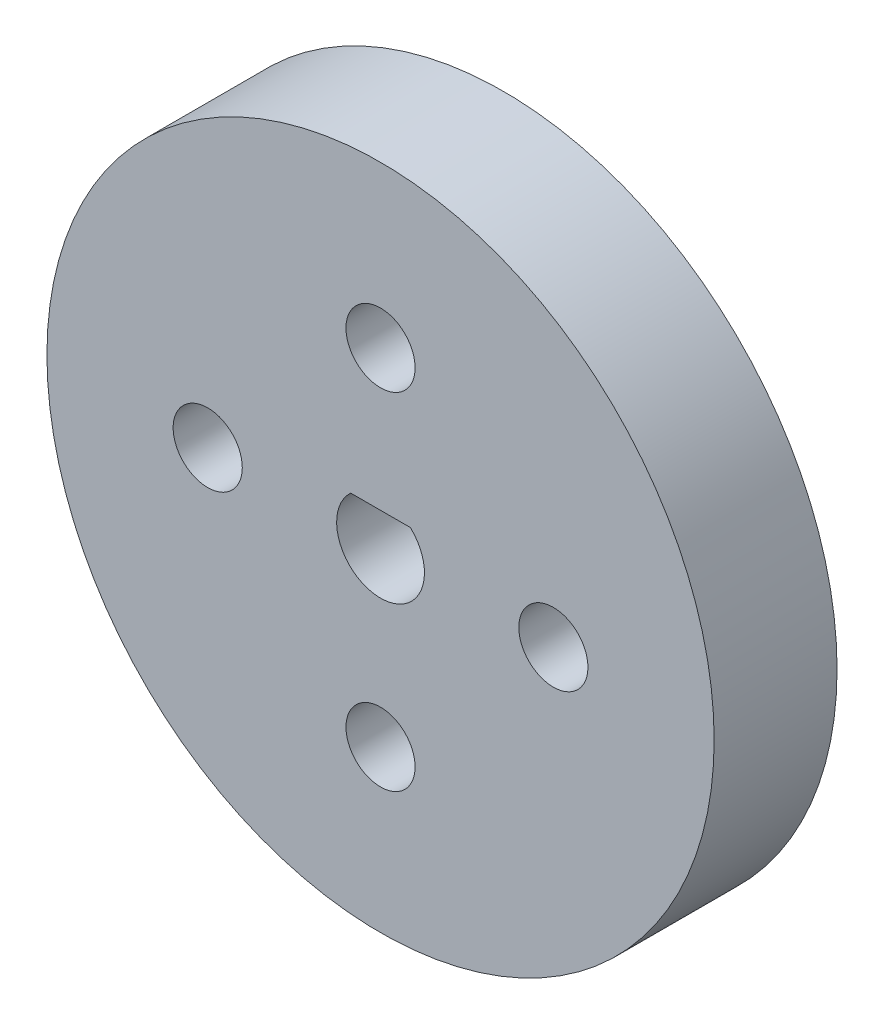
ISO-10303-21;
HEADER;
FILE_DESCRIPTION(('STEP AP214'),'2;1');
FILE_NAME('part.step','',(''),(''),'','','');
FILE_SCHEMA(('AUTOMOTIVE_DESIGN { 1 0 10303 214 1 1 1 1 }'));
ENDSEC;
DATA;
#1=APPLICATION_CONTEXT('core data for automotive mechanical design processes');
#2=APPLICATION_PROTOCOL_DEFINITION('international standard','automotive_design',2000,#1);
#3=PRODUCT_CONTEXT('',#1,'mechanical');
#4=PRODUCT('Part','Part','',(#3));
#5=PRODUCT_RELATED_PRODUCT_CATEGORY('part','',(#4));
#6=PRODUCT_DEFINITION_FORMATION('','',#4);
#7=PRODUCT_DEFINITION_CONTEXT('part definition',#1,'design');
#8=PRODUCT_DEFINITION('design','',#6,#7);
#9=PRODUCT_DEFINITION_SHAPE('','',#8);
#10=(LENGTH_UNIT() NAMED_UNIT(*) SI_UNIT(.MILLI.,.METRE.));
#11=(NAMED_UNIT(*) PLANE_ANGLE_UNIT() SI_UNIT($,.RADIAN.));
#12=(NAMED_UNIT(*) SI_UNIT($,.STERADIAN.) SOLID_ANGLE_UNIT());
#13=UNCERTAINTY_MEASURE_WITH_UNIT(LENGTH_MEASURE(1.E-05),#10,'distance_accuracy_value','');
#14=(GEOMETRIC_REPRESENTATION_CONTEXT(3) GLOBAL_UNCERTAINTY_ASSIGNED_CONTEXT((#13)) GLOBAL_UNIT_ASSIGNED_CONTEXT((#10,
#11,#12)) REPRESENTATION_CONTEXT('',''));
#15=CARTESIAN_POINT('',(0.,0.,0.));
#16=DIRECTION('',(0.,0.,1.));
#17=DIRECTION('',(1.,0.,0.));
#18=AXIS2_PLACEMENT_3D('',#15,#16,#17);
#19=CARTESIAN_POINT('',(0.,0.,5.334));
#20=DIRECTION('',(0.,0.,-1.));
#21=DIRECTION('',(-1.,0.,0.));
#22=AXIS2_PLACEMENT_3D('',#19,#20,#21);
#23=CYLINDRICAL_SURFACE('',#22,14.478);
#24=CARTESIAN_POINT('',(0.,0.,5.334));
#25=DIRECTION('',(0.,0.,1.));
#26=DIRECTION('',(1.,0.,0.));
#27=AXIS2_PLACEMENT_3D('',#24,#25,#26);
#28=CIRCLE('',#27,14.478);
#29=CARTESIAN_POINT('',(14.478,0.,5.334));
#30=VERTEX_POINT('',#29);
#31=EDGE_CURVE('E11',#30,#30,#28,.T.);
#32=ORIENTED_EDGE('',*,*,#31,.F.);
#33=EDGE_LOOP('',(#32));
#34=FACE_BOUND('',#33,.T.);
#35=CARTESIAN_POINT('',(0.,0.,0.));
#36=DIRECTION('',(0.,0.,1.));
#37=DIRECTION('',(1.,0.,0.));
#38=AXIS2_PLACEMENT_3D('',#35,#36,#37);
#39=CIRCLE('',#38,14.478);
#40=CARTESIAN_POINT('',(14.478,0.,0.));
#41=VERTEX_POINT('',#40);
#42=EDGE_CURVE('E36',#41,#41,#39,.T.);
#43=ORIENTED_EDGE('',*,*,#42,.T.);
#44=EDGE_LOOP('',(#43));
#45=FACE_BOUND('',#44,.T.);
#46=ADVANCED_FACE('F33',(#34,#45),#23,.T.);
#47=CARTESIAN_POINT('',(0.,0.,5.334));
#48=DIRECTION('',(0.,0.,1.));
#49=DIRECTION('',(1.,0.,0.));
#50=AXIS2_PLACEMENT_3D('',#47,#48,#49);
#51=PLANE('',#50);
#52=CARTESIAN_POINT('',(0.,-7.5,5.334));
#53=DIRECTION('',(0.,0.,-1.));
#54=DIRECTION('',(-1.,0.,0.));
#55=AXIS2_PLACEMENT_3D('',#52,#53,#54);
#56=CIRCLE('',#55,1.5);
#57=CARTESIAN_POINT('',(-1.5,-7.5,5.334));
#58=VERTEX_POINT('',#57);
#59=EDGE_CURVE('E73',#58,#58,#56,.T.);
#60=ORIENTED_EDGE('',*,*,#59,.T.);
#61=EDGE_LOOP('',(#60));
#62=FACE_BOUND('',#61,.T.);
#63=CARTESIAN_POINT('',(-7.5,0.,5.334));
#64=DIRECTION('',(0.,0.,-1.));
#65=DIRECTION('',(1.,0.,0.));
#66=AXIS2_PLACEMENT_3D('',#63,#64,#65);
#67=CIRCLE('',#66,1.49999999999982);
#68=CARTESIAN_POINT('',(-6.00000000000017,0.,5.334));
#69=VERTEX_POINT('',#68);
#70=EDGE_CURVE('E178',#69,#69,#67,.T.);
#71=ORIENTED_EDGE('',*,*,#70,.T.);
#72=EDGE_LOOP('',(#71));
#73=FACE_BOUND('',#72,.T.);
#74=CARTESIAN_POINT('',(7.5,0.,5.334));
#75=DIRECTION('',(0.,0.,-1.));
#76=DIRECTION('',(1.,0.,0.));
#77=AXIS2_PLACEMENT_3D('',#74,#75,#76);
#78=CIRCLE('',#77,1.5);
#79=CARTESIAN_POINT('',(9.,0.,5.334));
#80=VERTEX_POINT('',#79);
#81=EDGE_CURVE('E186',#80,#80,#78,.T.);
#82=ORIENTED_EDGE('',*,*,#81,.T.);
#83=EDGE_LOOP('',(#82));
#84=FACE_BOUND('',#83,.T.);
#85=CARTESIAN_POINT('',(0.,7.5,5.334));
#86=DIRECTION('',(0.,0.,-1.));
#87=DIRECTION('',(-1.,0.,0.));
#88=AXIS2_PLACEMENT_3D('',#85,#86,#87);
#89=CIRCLE('',#88,1.49999999999982);
#90=CARTESIAN_POINT('',(-1.4999999999998,7.5,5.334));
#91=VERTEX_POINT('',#90);
#92=EDGE_CURVE('E192',#91,#91,#89,.T.);
#93=ORIENTED_EDGE('',*,*,#92,.T.);
#94=EDGE_LOOP('',(#93));
#95=FACE_BOUND('',#94,.T.);
#96=CARTESIAN_POINT('',(0.,0.,5.334));
#97=DIRECTION('',(0.,0.,1.));
#98=DIRECTION('',(1.,0.,0.));
#99=AXIS2_PLACEMENT_3D('',#96,#97,#98);
#100=CIRCLE('',#99,1.905);
#101=CARTESIAN_POINT('',(-1.29515095645257,1.397,5.334));
#102=VERTEX_POINT('',#101);
#103=CARTESIAN_POINT('',(1.29515095645257,1.397,5.334));
#104=VERTEX_POINT('',#103);
#105=EDGE_CURVE('E47',#102,#104,#100,.T.);
#106=ORIENTED_EDGE('',*,*,#105,.F.);
#107=DIRECTION('',(1.,0.,0.));
#108=VECTOR('',#107,1.);
#109=CARTESIAN_POINT('',(-1.29515095645257,1.397,5.334));
#110=LINE('',#109,#108);
#111=EDGE_CURVE('E61',#102,#104,#110,.T.);
#112=ORIENTED_EDGE('',*,*,#111,.T.);
#113=EDGE_LOOP('',(#106,#112));
#114=FACE_BOUND('',#113,.T.);
#115=ORIENTED_EDGE('',*,*,#31,.T.);
#116=EDGE_LOOP('',(#115));
#117=FACE_BOUND('',#116,.T.);
#118=ADVANCED_FACE('F58',(#62,#73,#84,#95,#114,#117),#51,.T.);
#119=CARTESIAN_POINT('',(0.,0.,0.));
#120=DIRECTION('',(0.,0.,1.));
#121=DIRECTION('',(1.,0.,0.));
#122=AXIS2_PLACEMENT_3D('',#119,#120,#121);
#123=PLANE('',#122);
#124=CARTESIAN_POINT('',(0.,-7.5,0.));
#125=DIRECTION('',(0.,0.,-1.));
#126=DIRECTION('',(-1.,0.,0.));
#127=AXIS2_PLACEMENT_3D('',#124,#125,#126);
#128=CIRCLE('',#127,1.5);
#129=CARTESIAN_POINT('',(-1.5,-7.5,0.));
#130=VERTEX_POINT('',#129);
#131=EDGE_CURVE('E77',#130,#130,#128,.T.);
#132=ORIENTED_EDGE('',*,*,#131,.F.);
#133=EDGE_LOOP('',(#132));
#134=FACE_BOUND('',#133,.T.);
#135=CARTESIAN_POINT('',(-7.5,0.,0.));
#136=DIRECTION('',(0.,0.,-1.));
#137=DIRECTION('',(1.,0.,0.));
#138=AXIS2_PLACEMENT_3D('',#135,#136,#137);
#139=CIRCLE('',#138,1.49999999999982);
#140=CARTESIAN_POINT('',(-6.00000000000017,0.,0.));
#141=VERTEX_POINT('',#140);
#142=EDGE_CURVE('E181',#141,#141,#139,.T.);
#143=ORIENTED_EDGE('',*,*,#142,.F.);
#144=EDGE_LOOP('',(#143));
#145=FACE_BOUND('',#144,.T.);
#146=CARTESIAN_POINT('',(7.5,0.,0.));
#147=DIRECTION('',(0.,0.,-1.));
#148=DIRECTION('',(1.,0.,0.));
#149=AXIS2_PLACEMENT_3D('',#146,#147,#148);
#150=CIRCLE('',#149,1.5);
#151=CARTESIAN_POINT('',(9.,0.,0.));
#152=VERTEX_POINT('',#151);
#153=EDGE_CURVE('E189',#152,#152,#150,.T.);
#154=ORIENTED_EDGE('',*,*,#153,.F.);
#155=EDGE_LOOP('',(#154));
#156=FACE_BOUND('',#155,.T.);
#157=CARTESIAN_POINT('',(0.,7.5,0.));
#158=DIRECTION('',(0.,0.,-1.));
#159=DIRECTION('',(-1.,0.,0.));
#160=AXIS2_PLACEMENT_3D('',#157,#158,#159);
#161=CIRCLE('',#160,1.49999999999982);
#162=CARTESIAN_POINT('',(-1.4999999999998,7.5,0.));
#163=VERTEX_POINT('',#162);
#164=EDGE_CURVE('E194',#163,#163,#161,.T.);
#165=ORIENTED_EDGE('',*,*,#164,.F.);
#166=EDGE_LOOP('',(#165));
#167=FACE_BOUND('',#166,.T.);
#168=CARTESIAN_POINT('',(0.,0.,0.));
#169=DIRECTION('',(0.,0.,1.));
#170=DIRECTION('',(1.,0.,0.));
#171=AXIS2_PLACEMENT_3D('',#168,#169,#170);
#172=CIRCLE('',#171,1.905);
#173=CARTESIAN_POINT('',(1.29515095645257,1.397,0.));
#174=VERTEX_POINT('',#173);
#175=CARTESIAN_POINT('',(-1.29515095645257,1.397,0.));
#176=VERTEX_POINT('',#175);
#177=EDGE_CURVE('E62',#174,#176,#172,.F.);
#178=ORIENTED_EDGE('',*,*,#177,.F.);
#179=DIRECTION('',(1.,0.,0.));
#180=VECTOR('',#179,1.);
#181=CARTESIAN_POINT('',(-1.29515095645257,1.397,0.));
#182=LINE('',#181,#180);
#183=EDGE_CURVE('E70',#176,#174,#182,.T.);
#184=ORIENTED_EDGE('',*,*,#183,.F.);
#185=EDGE_LOOP('',(#178,#184));
#186=FACE_BOUND('',#185,.T.);
#187=ORIENTED_EDGE('',*,*,#42,.F.);
#188=EDGE_LOOP('',(#187));
#189=FACE_BOUND('',#188,.T.);
#190=ADVANCED_FACE('F86',(#134,#145,#156,#167,#186,#189),#123,.F.);
#191=CARTESIAN_POINT('',(0.,0.,-5.38815367264149));
#192=DIRECTION('',(0.,0.,1.));
#193=DIRECTION('',(1.,0.,0.));
#194=AXIS2_PLACEMENT_3D('',#191,#192,#193);
#195=CYLINDRICAL_SURFACE('',#194,1.905);
#196=ORIENTED_EDGE('',*,*,#105,.T.);
#197=DIRECTION('',(0.,0.,1.));
#198=VECTOR('',#197,1.);
#199=CARTESIAN_POINT('',(1.29515095645257,1.397,0.));
#200=LINE('',#199,#198);
#201=EDGE_CURVE('E51',#174,#104,#200,.T.);
#202=ORIENTED_EDGE('',*,*,#201,.F.);
#203=ORIENTED_EDGE('',*,*,#177,.T.);
#204=DIRECTION('',(0.,0.,1.));
#205=VECTOR('',#204,1.);
#206=CARTESIAN_POINT('',(-1.29515095645257,1.397,0.));
#207=LINE('',#206,#205);
#208=EDGE_CURVE('E65',#176,#102,#207,.T.);
#209=ORIENTED_EDGE('',*,*,#208,.T.);
#210=EDGE_LOOP('',(#196,#202,#203,#209));
#211=FACE_BOUND('',#210,.T.);
#212=ADVANCED_FACE('F66',(#211),#195,.F.);
#213=CARTESIAN_POINT('',(-1.29515095645257,1.397,0.));
#214=DIRECTION('',(0.,-1.,0.));
#215=DIRECTION('',(0.,0.,-1.));
#216=AXIS2_PLACEMENT_3D('',#213,#214,#215);
#217=PLANE('',#216);
#218=ORIENTED_EDGE('',*,*,#111,.F.);
#219=ORIENTED_EDGE('',*,*,#208,.F.);
#220=ORIENTED_EDGE('',*,*,#183,.T.);
#221=ORIENTED_EDGE('',*,*,#201,.T.);
#222=EDGE_LOOP('',(#218,#219,#220,#221));
#223=FACE_BOUND('',#222,.T.);
#224=ADVANCED_FACE('F72',(#223),#217,.T.);
#225=CARTESIAN_POINT('',(0.,7.5,5.334));
#226=DIRECTION('',(0.,0.,-1.));
#227=DIRECTION('',(-1.,0.,0.));
#228=AXIS2_PLACEMENT_3D('',#225,#226,#227);
#229=CYLINDRICAL_SURFACE('',#228,1.49999999999982);
#230=ORIENTED_EDGE('',*,*,#92,.F.);
#231=EDGE_LOOP('',(#230));
#232=FACE_BOUND('',#231,.T.);
#233=ORIENTED_EDGE('',*,*,#164,.T.);
#234=EDGE_LOOP('',(#233));
#235=FACE_BOUND('',#234,.T.);
#236=ADVANCED_FACE('F124',(#232,#235),#229,.F.);
#237=CARTESIAN_POINT('',(7.5,0.,5.334));
#238=DIRECTION('',(0.,0.,-1.));
#239=DIRECTION('',(-1.,0.,0.));
#240=AXIS2_PLACEMENT_3D('',#237,#238,#239);
#241=CYLINDRICAL_SURFACE('',#240,1.5);
#242=ORIENTED_EDGE('',*,*,#81,.F.);
#243=EDGE_LOOP('',(#242));
#244=FACE_BOUND('',#243,.T.);
#245=ORIENTED_EDGE('',*,*,#153,.T.);
#246=EDGE_LOOP('',(#245));
#247=FACE_BOUND('',#246,.T.);
#248=ADVANCED_FACE('F129',(#244,#247),#241,.F.);
#249=CARTESIAN_POINT('',(-7.5,0.,5.334));
#250=DIRECTION('',(0.,0.,-1.));
#251=DIRECTION('',(-1.,0.,0.));
#252=AXIS2_PLACEMENT_3D('',#249,#250,#251);
#253=CYLINDRICAL_SURFACE('',#252,1.49999999999982);
#254=ORIENTED_EDGE('',*,*,#70,.F.);
#255=EDGE_LOOP('',(#254));
#256=FACE_BOUND('',#255,.T.);
#257=ORIENTED_EDGE('',*,*,#142,.T.);
#258=EDGE_LOOP('',(#257));
#259=FACE_BOUND('',#258,.T.);
#260=ADVANCED_FACE('F139',(#256,#259),#253,.F.);
#261=CARTESIAN_POINT('',(0.,-7.5,5.334));
#262=DIRECTION('',(0.,0.,-1.));
#263=DIRECTION('',(-1.,0.,0.));
#264=AXIS2_PLACEMENT_3D('',#261,#262,#263);
#265=CYLINDRICAL_SURFACE('',#264,1.5);
#266=ORIENTED_EDGE('',*,*,#59,.F.);
#267=EDGE_LOOP('',(#266));
#268=FACE_BOUND('',#267,.T.);
#269=ORIENTED_EDGE('',*,*,#131,.T.);
#270=EDGE_LOOP('',(#269));
#271=FACE_BOUND('',#270,.T.);
#272=ADVANCED_FACE('F149',(#268,#271),#265,.F.);
#273=CLOSED_SHELL('',(#46,#118,#190,#212,#224,#236,#248,#260,#272));
#274=MANIFOLD_SOLID_BREP('B2',#273);
#275=ADVANCED_BREP_SHAPE_REPRESENTATION('',(#18,#274),#14);
#276=SHAPE_DEFINITION_REPRESENTATION(#9,#275);
ENDSEC;
END-ISO-10303-21;
